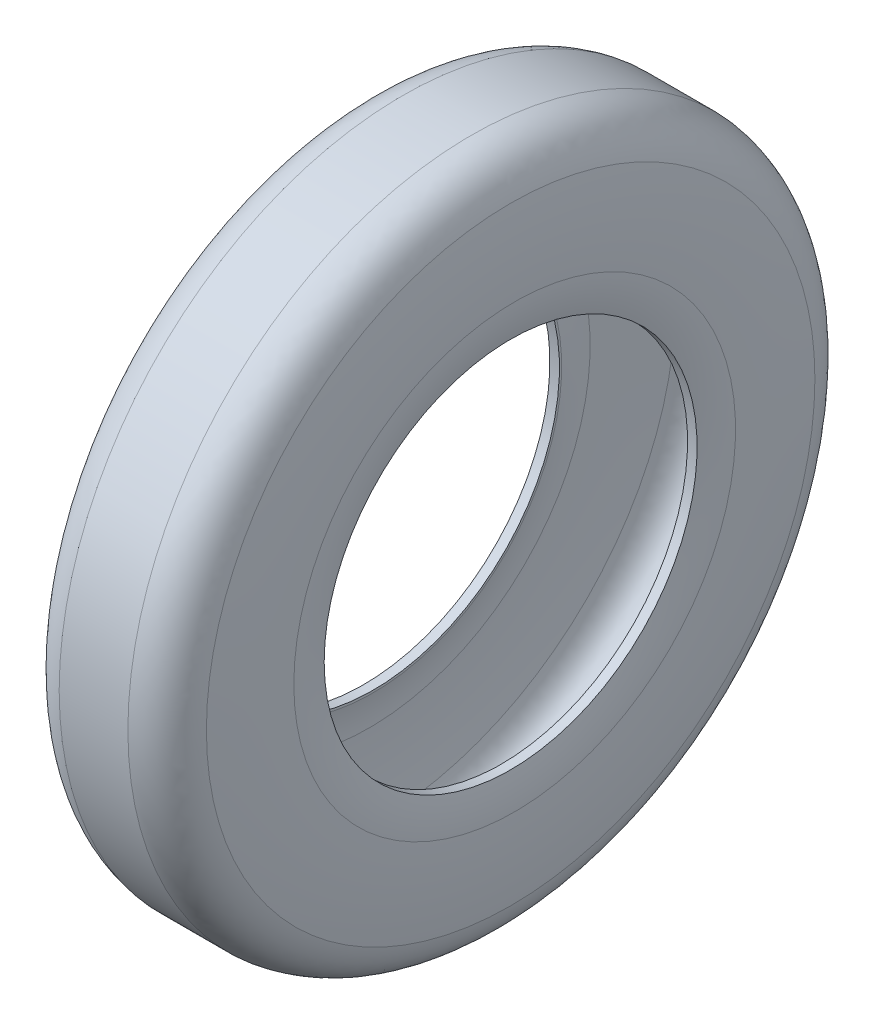
ISO-10303-21;
HEADER;
FILE_DESCRIPTION(('STEP AP214'),'2;1');
FILE_NAME('part.step','',(''),(''),'','','');
FILE_SCHEMA(('AUTOMOTIVE_DESIGN { 1 0 10303 214 1 1 1 1 }'));
ENDSEC;
DATA;
#1=APPLICATION_CONTEXT('core data for automotive mechanical design processes');
#2=APPLICATION_PROTOCOL_DEFINITION('international standard','automotive_design',2000,#1);
#3=PRODUCT_CONTEXT('',#1,'mechanical');
#4=PRODUCT('Part','Part','',(#3));
#5=PRODUCT_RELATED_PRODUCT_CATEGORY('part','',(#4));
#6=PRODUCT_DEFINITION_FORMATION('','',#4);
#7=PRODUCT_DEFINITION_CONTEXT('part definition',#1,'design');
#8=PRODUCT_DEFINITION('design','',#6,#7);
#9=PRODUCT_DEFINITION_SHAPE('','',#8);
#10=(LENGTH_UNIT() NAMED_UNIT(*) SI_UNIT(.MILLI.,.METRE.));
#11=(NAMED_UNIT(*) PLANE_ANGLE_UNIT() SI_UNIT($,.RADIAN.));
#12=(NAMED_UNIT(*) SI_UNIT($,.STERADIAN.) SOLID_ANGLE_UNIT());
#13=UNCERTAINTY_MEASURE_WITH_UNIT(LENGTH_MEASURE(1.E-05),#10,'distance_accuracy_value','');
#14=(GEOMETRIC_REPRESENTATION_CONTEXT(3) GLOBAL_UNCERTAINTY_ASSIGNED_CONTEXT((#13)) GLOBAL_UNIT_ASSIGNED_CONTEXT((#10,
#11,#12)) REPRESENTATION_CONTEXT('',''));
#15=CARTESIAN_POINT('',(0.,0.,0.));
#16=DIRECTION('',(0.,0.,1.));
#17=DIRECTION('',(1.,0.,0.));
#18=AXIS2_PLACEMENT_3D('',#15,#16,#17);
#19=CARTESIAN_POINT('',(-39.5580046113255,112.515379932757,0.));
#20=CARTESIAN_POINT('',(-39.553838696621,103.632489558168,0.));
#21=CARTESIAN_POINT('',(-37.5,95.,0.));
#22=B_SPLINE_CURVE_WITH_KNOTS('',2,(#19,#20,#21),.UNSPECIFIED.,.F.,.F.,(3,3),(0.,1.),.UNSPECIFIED.);
#23=CARTESIAN_POINT('',(-171.693896406709,0.,0.));
#24=DIRECTION('',(-1.,0.,0.));
#25=AXIS1_PLACEMENT('',#23,#24);
#26=SURFACE_OF_REVOLUTION('',#22,#25);
#27=CARTESIAN_POINT('',(-37.5,0.,0.));
#28=DIRECTION('',(-1.,0.,0.));
#29=DIRECTION('',(0.,0.,1.));
#30=AXIS2_PLACEMENT_3D('',#27,#28,#29);
#31=CIRCLE('',#30,95.);
#32=CARTESIAN_POINT('',(-37.5,0.,95.));
#33=VERTEX_POINT('',#32);
#34=EDGE_CURVE('E10',#33,#33,#31,.T.);
#35=ORIENTED_EDGE('',*,*,#34,.F.);
#36=EDGE_LOOP('',(#35));
#37=FACE_BOUND('',#36,.T.);
#38=CARTESIAN_POINT('',(-39.5580046113255,0.,0.));
#39=DIRECTION('',(-1.,0.,0.));
#40=DIRECTION('',(0.,0.,1.));
#41=AXIS2_PLACEMENT_3D('',#38,#39,#40);
#42=CIRCLE('',#41,112.515379932757);
#43=CARTESIAN_POINT('',(-39.5580046113255,0.,112.515379932757));
#44=VERTEX_POINT('',#43);
#45=EDGE_CURVE('E91',#44,#44,#42,.T.);
#46=ORIENTED_EDGE('',*,*,#45,.T.);
#47=EDGE_LOOP('',(#46));
#48=FACE_BOUND('',#47,.T.);
#49=ADVANCED_FACE('F32',(#37,#48),#26,.T.);
#50=CARTESIAN_POINT('',(-171.693896406709,0.,0.));
#51=DIRECTION('',(-1.,0.,0.));
#52=DIRECTION('',(0.,0.,1.));
#53=AXIS2_PLACEMENT_3D('',#50,#51,#52);
#54=CYLINDRICAL_SURFACE('',#53,95.);
#55=CARTESIAN_POINT('',(-32.635776521284,0.,0.));
#56=DIRECTION('',(-1.,0.,0.));
#57=DIRECTION('',(0.,0.,1.));
#58=AXIS2_PLACEMENT_3D('',#55,#56,#57);
#59=CIRCLE('',#58,95.);
#60=CARTESIAN_POINT('',(-32.635776521284,0.,95.));
#61=VERTEX_POINT('',#60);
#62=EDGE_CURVE('E39',#61,#61,#59,.T.);
#63=ORIENTED_EDGE('',*,*,#62,.F.);
#64=EDGE_LOOP('',(#63));
#65=FACE_BOUND('',#64,.T.);
#66=ORIENTED_EDGE('',*,*,#34,.T.);
#67=EDGE_LOOP('',(#66));
#68=FACE_BOUND('',#67,.T.);
#69=ADVANCED_FACE('F224',(#65,#68),#54,.F.);
#70=CARTESIAN_POINT('',(-32.635776521284,95.,0.));
#71=DIRECTION('',(-1.,0.,0.));
#72=DIRECTION('',(0.,0.,1.));
#73=AXIS2_PLACEMENT_3D('',#70,#71,#72);
#74=PLANE('',#73);
#75=CARTESIAN_POINT('',(-32.635776521284,0.,0.));
#76=DIRECTION('',(-1.,0.,0.));
#77=DIRECTION('',(0.,0.,1.));
#78=AXIS2_PLACEMENT_3D('',#75,#76,#77);
#79=CIRCLE('',#78,96.1572942361855);
#80=CARTESIAN_POINT('',(-32.635776521284,0.,96.1572942361855));
#81=VERTEX_POINT('',#80);
#82=EDGE_CURVE('E43',#81,#81,#79,.T.);
#83=ORIENTED_EDGE('',*,*,#82,.F.);
#84=EDGE_LOOP('',(#83));
#85=FACE_BOUND('',#84,.T.);
#86=ORIENTED_EDGE('',*,*,#62,.T.);
#87=EDGE_LOOP('',(#86));
#88=FACE_BOUND('',#87,.T.);
#89=ADVANCED_FACE('F209',(#85,#88),#74,.F.);
#90=CARTESIAN_POINT('',(-32.635776521284,96.1572942361855,0.));
#91=CARTESIAN_POINT('',(-34.5602061525656,104.242772285647,0.));
#92=CARTESIAN_POINT('',(-34.5580309929734,112.572805408085,0.));
#93=B_SPLINE_CURVE_WITH_KNOTS('',2,(#90,#91,#92),.UNSPECIFIED.,.F.,.F.,(3,3),(0.,
1.00310037407986),.UNSPECIFIED.);
#94=CARTESIAN_POINT('',(-171.693896406709,0.,0.));
#95=DIRECTION('',(-1.,0.,0.));
#96=AXIS1_PLACEMENT('',#94,#95);
#97=SURFACE_OF_REVOLUTION('',#93,#96);
#98=CARTESIAN_POINT('',(-34.5580309929734,0.,0.));
#99=DIRECTION('',(-1.,0.,0.));
#100=DIRECTION('',(0.,0.,1.));
#101=AXIS2_PLACEMENT_3D('',#98,#99,#100);
#102=CIRCLE('',#101,112.572805408085);
#103=CARTESIAN_POINT('',(-34.5580309929734,0.,112.572805408085));
#104=VERTEX_POINT('',#103);
#105=EDGE_CURVE('E47',#104,#104,#102,.T.);
#106=ORIENTED_EDGE('',*,*,#105,.F.);
#107=EDGE_LOOP('',(#106));
#108=FACE_BOUND('',#107,.T.);
#109=ORIENTED_EDGE('',*,*,#82,.T.);
#110=EDGE_LOOP('',(#109));
#111=FACE_BOUND('',#110,.T.);
#112=ADVANCED_FACE('F205',(#108,#111),#97,.T.);
#113=CARTESIAN_POINT('',(-34.5580309929734,112.572805408085,0.));
#114=CARTESIAN_POINT('',(-35.0305988164813,133.401140869275,0.));
#115=CARTESIAN_POINT('',(-32.5718831883125,154.100277591652,0.));
#116=B_SPLINE_CURVE_WITH_KNOTS('',2,(#113,#114,#115),.UNSPECIFIED.,.F.,.F.,(3,3),
(-0.00129214776592869,0.99268142893794),.UNSPECIFIED.);
#117=CARTESIAN_POINT('',(-171.693896406709,0.,0.));
#118=DIRECTION('',(-1.,0.,0.));
#119=AXIS1_PLACEMENT('',#117,#118);
#120=SURFACE_OF_REVOLUTION('',#116,#119);
#121=CARTESIAN_POINT('',(-32.5718831883125,0.,0.));
#122=DIRECTION('',(-1.,0.,0.));
#123=DIRECTION('',(0.,0.,1.));
#124=AXIS2_PLACEMENT_3D('',#121,#122,#123);
#125=CIRCLE('',#124,154.100277591652);
#126=CARTESIAN_POINT('',(-32.5718831883125,0.,154.100277591652));
#127=VERTEX_POINT('',#126);
#128=EDGE_CURVE('E52',#127,#127,#125,.T.);
#129=ORIENTED_EDGE('',*,*,#128,.F.);
#130=EDGE_LOOP('',(#129));
#131=FACE_BOUND('',#130,.T.);
#132=ORIENTED_EDGE('',*,*,#105,.T.);
#133=EDGE_LOOP('',(#132));
#134=FACE_BOUND('',#133,.T.);
#135=ADVANCED_FACE('F201',(#131,#134),#120,.T.);
#136=CARTESIAN_POINT('',(-32.5718831883125,154.100277591652,0.));
#137=CARTESIAN_POINT('',(-31.8471054710312,156.962883589359,0.));
#138=CARTESIAN_POINT('',(-29.8373746003755,161.506356907148,0.));
#139=CARTESIAN_POINT('',(-26.9425016144217,165.499652433292,0.));
#140=CARTESIAN_POINT('',(-23.3006905772927,168.104519160294,0.));
#141=CARTESIAN_POINT('',(-19.4742597634233,169.620198998483,0.));
#142=CARTESIAN_POINT('',(-17.124055565803,170.,0.));
#143=B_SPLINE_CURVE_WITH_KNOTS('',2,(#136,#137,#138,#139,#140,#141,#142),.UNSPECIFIED.,.F.,.F.,
(3,1,1,1,1,3),(0.00902413039610607,0.192379486057529,0.375734841718953,0.620208649267517,
0.80356400492894,0.986919360590364),.UNSPECIFIED.);
#144=CARTESIAN_POINT('',(-171.693896406709,0.,0.));
#145=DIRECTION('',(-1.,0.,0.));
#146=AXIS1_PLACEMENT('',#144,#145);
#147=SURFACE_OF_REVOLUTION('',#143,#146);
#148=CARTESIAN_POINT('',(-17.124055565803,0.,0.));
#149=DIRECTION('',(-1.,0.,0.));
#150=DIRECTION('',(0.,0.,1.));
#151=AXIS2_PLACEMENT_3D('',#148,#149,#150);
#152=CIRCLE('',#151,170.);
#153=CARTESIAN_POINT('',(-17.124055565803,0.,170.));
#154=VERTEX_POINT('',#153);
#155=EDGE_CURVE('E55',#154,#154,#152,.T.);
#156=ORIENTED_EDGE('',*,*,#155,.F.);
#157=EDGE_LOOP('',(#156));
#158=FACE_BOUND('',#157,.T.);
#159=ORIENTED_EDGE('',*,*,#128,.T.);
#160=EDGE_LOOP('',(#159));
#161=FACE_BOUND('',#160,.T.);
#162=ADVANCED_FACE('F197',(#158,#161),#147,.T.);
#163=CARTESIAN_POINT('',(-171.693896406709,0.,0.));
#164=DIRECTION('',(-1.,0.,0.));
#165=DIRECTION('',(0.,0.,1.));
#166=AXIS2_PLACEMENT_3D('',#163,#164,#165);
#167=CYLINDRICAL_SURFACE('',#166,170.);
#168=CARTESIAN_POINT('',(17.1240555658028,0.,0.));
#169=DIRECTION('',(-1.,0.,0.));
#170=DIRECTION('',(0.,0.,1.));
#171=AXIS2_PLACEMENT_3D('',#168,#169,#170);
#172=CIRCLE('',#171,170.);
#173=CARTESIAN_POINT('',(17.1240555658028,0.,170.));
#174=VERTEX_POINT('',#173);
#175=EDGE_CURVE('E58',#174,#174,#172,.T.);
#176=ORIENTED_EDGE('',*,*,#175,.F.);
#177=EDGE_LOOP('',(#176));
#178=FACE_BOUND('',#177,.T.);
#179=ORIENTED_EDGE('',*,*,#155,.T.);
#180=EDGE_LOOP('',(#179));
#181=FACE_BOUND('',#180,.T.);
#182=ADVANCED_FACE('F200',(#178,#181),#167,.F.);
#183=CARTESIAN_POINT('',(17.1240555658028,170.,0.));
#184=CARTESIAN_POINT('',(19.4742597634231,169.620198998483,0.));
#185=CARTESIAN_POINT('',(23.3006905772925,168.104519160294,0.));
#186=CARTESIAN_POINT('',(26.9425016144216,165.499652433292,0.));
#187=CARTESIAN_POINT('',(29.8373746003754,161.506356907148,0.));
#188=CARTESIAN_POINT('',(31.8471054710311,156.962883589359,0.));
#189=CARTESIAN_POINT('',(32.5718831883124,154.100277591652,0.));
#190=B_SPLINE_CURVE_WITH_KNOTS('',2,(#183,#184,#185,#186,#187,#188,#189),.UNSPECIFIED.,.F.,.F.,
(3,1,1,1,1,3),(0.00902413039611005,0.192379486057534,0.375734841718958,0.620208649267524,
0.803564004928948,0.986919360590372),.UNSPECIFIED.);
#191=CARTESIAN_POINT('',(-171.693896406709,0.,0.));
#192=DIRECTION('',(-1.,0.,0.));
#193=AXIS1_PLACEMENT('',#191,#192);
#194=SURFACE_OF_REVOLUTION('',#190,#193);
#195=CARTESIAN_POINT('',(32.5718831883124,0.,0.));
#196=DIRECTION('',(-1.,0.,0.));
#197=DIRECTION('',(0.,0.,1.));
#198=AXIS2_PLACEMENT_3D('',#195,#196,#197);
#199=CIRCLE('',#198,154.100277591652);
#200=CARTESIAN_POINT('',(32.5718831883124,0.,154.100277591652));
#201=VERTEX_POINT('',#200);
#202=EDGE_CURVE('E61',#201,#201,#199,.T.);
#203=ORIENTED_EDGE('',*,*,#202,.F.);
#204=EDGE_LOOP('',(#203));
#205=FACE_BOUND('',#204,.T.);
#206=ORIENTED_EDGE('',*,*,#175,.T.);
#207=EDGE_LOOP('',(#206));
#208=FACE_BOUND('',#207,.T.);
#209=ADVANCED_FACE('F168',(#205,#208),#194,.T.);
#210=CARTESIAN_POINT('',(32.5718831883125,154.100277591652,0.));
#211=CARTESIAN_POINT('',(35.0305988164813,133.401140869275,0.));
#212=CARTESIAN_POINT('',(34.5580309929734,112.572805408085,0.));
#213=B_SPLINE_CURVE_WITH_KNOTS('',2,(#210,#211,#212),.UNSPECIFIED.,.F.,.F.,(3,3),
(-0.00129214776592879,0.992681428937944),.UNSPECIFIED.);
#214=CARTESIAN_POINT('',(-171.693896406709,0.,0.));
#215=DIRECTION('',(-1.,0.,0.));
#216=AXIS1_PLACEMENT('',#214,#215);
#217=SURFACE_OF_REVOLUTION('',#213,#216);
#218=CARTESIAN_POINT('',(34.5580309929734,0.,0.));
#219=DIRECTION('',(-1.,0.,0.));
#220=DIRECTION('',(0.,0.,1.));
#221=AXIS2_PLACEMENT_3D('',#218,#219,#220);
#222=CIRCLE('',#221,112.572805408085);
#223=CARTESIAN_POINT('',(34.5580309929734,0.,112.572805408085));
#224=VERTEX_POINT('',#223);
#225=EDGE_CURVE('E64',#224,#224,#222,.T.);
#226=ORIENTED_EDGE('',*,*,#225,.F.);
#227=EDGE_LOOP('',(#226));
#228=FACE_BOUND('',#227,.T.);
#229=ORIENTED_EDGE('',*,*,#202,.T.);
#230=EDGE_LOOP('',(#229));
#231=FACE_BOUND('',#230,.T.);
#232=ADVANCED_FACE('F164',(#228,#231),#217,.T.);
#233=CARTESIAN_POINT('',(34.5580309929734,112.572805408085,0.));
#234=CARTESIAN_POINT('',(34.5602061525656,104.242772285647,0.));
#235=CARTESIAN_POINT('',(32.635776521284,96.1572942361855,0.));
#236=B_SPLINE_CURVE_WITH_KNOTS('',2,(#233,#234,#235),.UNSPECIFIED.,.F.,.F.,(3,3),(0.,
1.00310037407986),.UNSPECIFIED.);
#237=CARTESIAN_POINT('',(-171.693896406709,0.,0.));
#238=DIRECTION('',(-1.,0.,0.));
#239=AXIS1_PLACEMENT('',#237,#238);
#240=SURFACE_OF_REVOLUTION('',#236,#239);
#241=CARTESIAN_POINT('',(32.635776521284,0.,0.));
#242=DIRECTION('',(-1.,0.,0.));
#243=DIRECTION('',(0.,0.,1.));
#244=AXIS2_PLACEMENT_3D('',#241,#242,#243);
#245=CIRCLE('',#244,96.1572942361855);
#246=CARTESIAN_POINT('',(32.635776521284,0.,96.1572942361855));
#247=VERTEX_POINT('',#246);
#248=EDGE_CURVE('E67',#247,#247,#245,.T.);
#249=ORIENTED_EDGE('',*,*,#248,.F.);
#250=EDGE_LOOP('',(#249));
#251=FACE_BOUND('',#250,.T.);
#252=ORIENTED_EDGE('',*,*,#225,.T.);
#253=EDGE_LOOP('',(#252));
#254=FACE_BOUND('',#253,.T.);
#255=ADVANCED_FACE('F160',(#251,#254),#240,.T.);
#256=CARTESIAN_POINT('',(32.635776521284,95.0000000000001,0.));
#257=DIRECTION('',(1.,0.,0.));
#258=DIRECTION('',(0.,0.,-1.));
#259=AXIS2_PLACEMENT_3D('',#256,#257,#258);
#260=PLANE('',#259);
#261=CARTESIAN_POINT('',(32.635776521284,0.,0.));
#262=DIRECTION('',(-1.,0.,0.));
#263=DIRECTION('',(0.,0.,1.));
#264=AXIS2_PLACEMENT_3D('',#261,#262,#263);
#265=CIRCLE('',#264,95.0000000000001);
#266=CARTESIAN_POINT('',(32.635776521284,0.,95.0000000000001));
#267=VERTEX_POINT('',#266);
#268=EDGE_CURVE('E70',#267,#267,#265,.T.);
#269=ORIENTED_EDGE('',*,*,#268,.F.);
#270=EDGE_LOOP('',(#269));
#271=FACE_BOUND('',#270,.T.);
#272=ORIENTED_EDGE('',*,*,#248,.T.);
#273=EDGE_LOOP('',(#272));
#274=FACE_BOUND('',#273,.T.);
#275=ADVANCED_FACE('F156',(#271,#274),#260,.F.);
#276=CARTESIAN_POINT('',(-171.693896406709,0.,0.));
#277=DIRECTION('',(-1.,0.,0.));
#278=DIRECTION('',(0.,0.,1.));
#279=AXIS2_PLACEMENT_3D('',#276,#277,#278);
#280=CYLINDRICAL_SURFACE('',#279,95.0000000000001);
#281=CARTESIAN_POINT('',(37.5,0.,0.));
#282=DIRECTION('',(-1.,0.,0.));
#283=DIRECTION('',(0.,0.,1.));
#284=AXIS2_PLACEMENT_3D('',#281,#282,#283);
#285=CIRCLE('',#284,95.0000000000001);
#286=CARTESIAN_POINT('',(37.5,0.,95.0000000000001));
#287=VERTEX_POINT('',#286);
#288=EDGE_CURVE('E73',#287,#287,#285,.T.);
#289=ORIENTED_EDGE('',*,*,#288,.F.);
#290=EDGE_LOOP('',(#289));
#291=FACE_BOUND('',#290,.T.);
#292=ORIENTED_EDGE('',*,*,#268,.T.);
#293=EDGE_LOOP('',(#292));
#294=FACE_BOUND('',#293,.T.);
#295=ADVANCED_FACE('F152',(#291,#294),#280,.F.);
#296=CARTESIAN_POINT('',(37.5,95.,0.));
#297=CARTESIAN_POINT('',(39.553838696621,103.632489558168,0.));
#298=CARTESIAN_POINT('',(39.5580046113255,112.515379932757,0.));
#299=B_SPLINE_CURVE_WITH_KNOTS('',2,(#296,#297,#298),.UNSPECIFIED.,.F.,.F.,(3,3),(0.,1.),.UNSPECIFIED.);
#300=CARTESIAN_POINT('',(-171.693896406709,0.,0.));
#301=DIRECTION('',(-1.,0.,0.));
#302=AXIS1_PLACEMENT('',#300,#301);
#303=SURFACE_OF_REVOLUTION('',#299,#302);
#304=CARTESIAN_POINT('',(39.5580046113255,0.,0.));
#305=DIRECTION('',(-1.,0.,0.));
#306=DIRECTION('',(0.,0.,1.));
#307=AXIS2_PLACEMENT_3D('',#304,#305,#306);
#308=CIRCLE('',#307,112.515379932757);
#309=CARTESIAN_POINT('',(39.5580046113255,0.,112.515379932757));
#310=VERTEX_POINT('',#309);
#311=EDGE_CURVE('E76',#310,#310,#308,.T.);
#312=ORIENTED_EDGE('',*,*,#311,.F.);
#313=EDGE_LOOP('',(#312));
#314=FACE_BOUND('',#313,.T.);
#315=ORIENTED_EDGE('',*,*,#288,.T.);
#316=EDGE_LOOP('',(#315));
#317=FACE_BOUND('',#316,.T.);
#318=ADVANCED_FACE('F149',(#314,#317),#303,.T.);
#319=CARTESIAN_POINT('',(39.5580046113255,112.515379932757,0.));
#320=CARTESIAN_POINT('',(40.037526357967,133.823558291004,0.));
#321=CARTESIAN_POINT('',(37.5,155.,0.));
#322=B_SPLINE_CURVE_WITH_KNOTS('',2,(#319,#320,#321),.UNSPECIFIED.,.F.,.F.,(3,3),(0.,1.),.UNSPECIFIED.);
#323=CARTESIAN_POINT('',(-171.693896406709,0.,0.));
#324=DIRECTION('',(-1.,0.,0.));
#325=AXIS1_PLACEMENT('',#323,#324);
#326=SURFACE_OF_REVOLUTION('',#322,#325);
#327=CARTESIAN_POINT('',(37.5,0.,0.));
#328=DIRECTION('',(-1.,0.,0.));
#329=DIRECTION('',(0.,0.,1.));
#330=AXIS2_PLACEMENT_3D('',#327,#328,#329);
#331=CIRCLE('',#330,155.);
#332=CARTESIAN_POINT('',(37.5,0.,155.));
#333=VERTEX_POINT('',#332);
#334=EDGE_CURVE('E79',#333,#333,#331,.T.);
#335=ORIENTED_EDGE('',*,*,#334,.F.);
#336=EDGE_LOOP('',(#335));
#337=FACE_BOUND('',#336,.T.);
#338=ORIENTED_EDGE('',*,*,#311,.T.);
#339=EDGE_LOOP('',(#338));
#340=FACE_BOUND('',#339,.T.);
#341=ADVANCED_FACE('F121',(#337,#340),#326,.T.);
#342=CARTESIAN_POINT('',(37.5,155.,0.));
#343=CARTESIAN_POINT('',(33.1808310767638,172.735676283006,0.));
#344=CARTESIAN_POINT('',(17.4999999999998,175.,0.));
#345=B_SPLINE_CURVE_WITH_KNOTS('',2,(#342,#343,#344),.UNSPECIFIED.,.F.,.F.,(3,3),(0.,1.),.UNSPECIFIED.);
#346=CARTESIAN_POINT('',(-171.693896406709,0.,0.));
#347=DIRECTION('',(-1.,0.,0.));
#348=AXIS1_PLACEMENT('',#346,#347);
#349=SURFACE_OF_REVOLUTION('',#345,#348);
#350=CARTESIAN_POINT('',(17.4999999999999,0.,0.));
#351=DIRECTION('',(-1.,0.,0.));
#352=DIRECTION('',(0.,0.,1.));
#353=AXIS2_PLACEMENT_3D('',#350,#351,#352);
#354=CIRCLE('',#353,175.);
#355=CARTESIAN_POINT('',(17.4999999999999,0.,175.));
#356=VERTEX_POINT('',#355);
#357=EDGE_CURVE('E82',#356,#356,#354,.T.);
#358=ORIENTED_EDGE('',*,*,#357,.F.);
#359=EDGE_LOOP('',(#358));
#360=FACE_BOUND('',#359,.T.);
#361=ORIENTED_EDGE('',*,*,#334,.T.);
#362=EDGE_LOOP('',(#361));
#363=FACE_BOUND('',#362,.T.);
#364=ADVANCED_FACE('F117',(#360,#363),#349,.T.);
#365=CARTESIAN_POINT('',(-171.693896406709,0.,0.));
#366=DIRECTION('',(-1.,0.,0.));
#367=DIRECTION('',(0.,0.,1.));
#368=AXIS2_PLACEMENT_3D('',#365,#366,#367);
#369=CYLINDRICAL_SURFACE('',#368,175.);
#370=CARTESIAN_POINT('',(-17.4999999999999,0.,0.));
#371=DIRECTION('',(-1.,0.,0.));
#372=DIRECTION('',(0.,0.,1.));
#373=AXIS2_PLACEMENT_3D('',#370,#371,#372);
#374=CIRCLE('',#373,175.);
#375=CARTESIAN_POINT('',(-17.4999999999999,0.,175.));
#376=VERTEX_POINT('',#375);
#377=EDGE_CURVE('E85',#376,#376,#374,.T.);
#378=ORIENTED_EDGE('',*,*,#377,.F.);
#379=EDGE_LOOP('',(#378));
#380=FACE_BOUND('',#379,.T.);
#381=ORIENTED_EDGE('',*,*,#357,.T.);
#382=EDGE_LOOP('',(#381));
#383=FACE_BOUND('',#382,.T.);
#384=ADVANCED_FACE('F113',(#380,#383),#369,.T.);
#385=CARTESIAN_POINT('',(-17.4999999999999,175.,0.));
#386=CARTESIAN_POINT('',(-33.1808310767638,172.735676283006,0.));
#387=CARTESIAN_POINT('',(-37.5,155.,0.));
#388=B_SPLINE_CURVE_WITH_KNOTS('',2,(#385,#386,#387),.UNSPECIFIED.,.F.,.F.,(3,3),(0.,1.),.UNSPECIFIED.);
#389=CARTESIAN_POINT('',(-171.693896406709,0.,0.));
#390=DIRECTION('',(-1.,0.,0.));
#391=AXIS1_PLACEMENT('',#389,#390);
#392=SURFACE_OF_REVOLUTION('',#388,#391);
#393=CARTESIAN_POINT('',(-37.5,0.,0.));
#394=DIRECTION('',(-1.,0.,0.));
#395=DIRECTION('',(0.,0.,1.));
#396=AXIS2_PLACEMENT_3D('',#393,#394,#395);
#397=CIRCLE('',#396,155.);
#398=CARTESIAN_POINT('',(-37.5,0.,155.));
#399=VERTEX_POINT('',#398);
#400=EDGE_CURVE('E88',#399,#399,#397,.T.);
#401=ORIENTED_EDGE('',*,*,#400,.F.);
#402=EDGE_LOOP('',(#401));
#403=FACE_BOUND('',#402,.T.);
#404=ORIENTED_EDGE('',*,*,#377,.T.);
#405=EDGE_LOOP('',(#404));
#406=FACE_BOUND('',#405,.T.);
#407=ADVANCED_FACE('F109',(#403,#406),#392,.T.);
#408=CARTESIAN_POINT('',(-37.5,155.,0.));
#409=CARTESIAN_POINT('',(-40.037526357967,133.823558291004,0.));
#410=CARTESIAN_POINT('',(-39.5580046113255,112.515379932757,0.));
#411=B_SPLINE_CURVE_WITH_KNOTS('',2,(#408,#409,#410),.UNSPECIFIED.,.F.,.F.,(3,3),(0.,1.),.UNSPECIFIED.);
#412=CARTESIAN_POINT('',(-171.693896406709,0.,0.));
#413=DIRECTION('',(-1.,0.,0.));
#414=AXIS1_PLACEMENT('',#412,#413);
#415=SURFACE_OF_REVOLUTION('',#411,#414);
#416=ORIENTED_EDGE('',*,*,#45,.F.);
#417=EDGE_LOOP('',(#416));
#418=FACE_BOUND('',#417,.T.);
#419=ORIENTED_EDGE('',*,*,#400,.T.);
#420=EDGE_LOOP('',(#419));
#421=FACE_BOUND('',#420,.T.);
#422=ADVANCED_FACE('F106',(#418,#421),#415,.T.);
#423=CLOSED_SHELL('',(#49,#69,#89,#112,#135,#162,#182,#209,#232,#255,#275,#295,#318,#341,#364,
#384,#407,#422));
#424=MANIFOLD_SOLID_BREP('B2',#423);
#425=ADVANCED_BREP_SHAPE_REPRESENTATION('',(#18,#424),#14);
#426=SHAPE_DEFINITION_REPRESENTATION(#9,#425);
ENDSEC;
END-ISO-10303-21;
